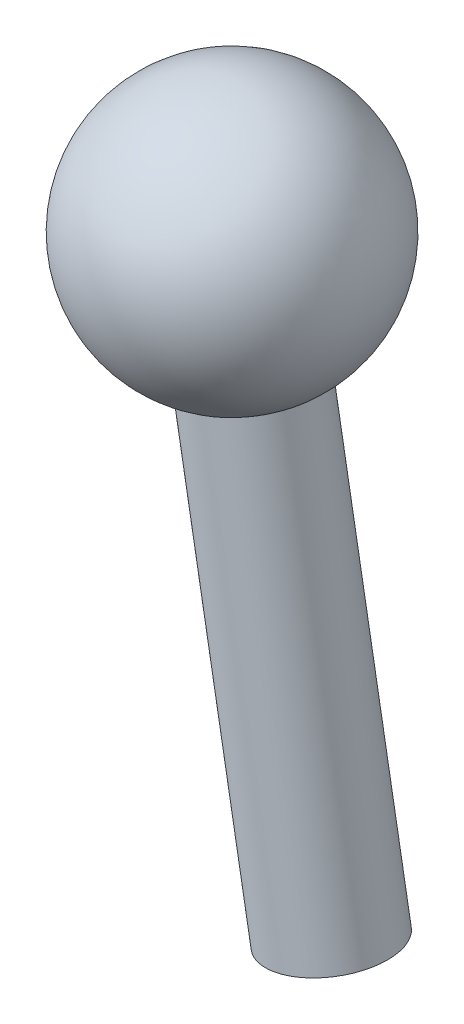
ISO-10303-21;
HEADER;
FILE_DESCRIPTION(('STEP AP214'),'2;1');
FILE_NAME('part.step','',(''),(''),'','','');
FILE_SCHEMA(('AUTOMOTIVE_DESIGN { 1 0 10303 214 1 1 1 1 }'));
ENDSEC;
DATA;
#1=APPLICATION_CONTEXT('core data for automotive mechanical design processes');
#2=APPLICATION_PROTOCOL_DEFINITION('international standard','automotive_design',2000,#1);
#3=PRODUCT_CONTEXT('',#1,'mechanical');
#4=PRODUCT('Part','Part','',(#3));
#5=PRODUCT_RELATED_PRODUCT_CATEGORY('part','',(#4));
#6=PRODUCT_DEFINITION_FORMATION('','',#4);
#7=PRODUCT_DEFINITION_CONTEXT('part definition',#1,'design');
#8=PRODUCT_DEFINITION('design','',#6,#7);
#9=PRODUCT_DEFINITION_SHAPE('','',#8);
#10=(LENGTH_UNIT() NAMED_UNIT(*) SI_UNIT(.MILLI.,.METRE.));
#11=(NAMED_UNIT(*) PLANE_ANGLE_UNIT() SI_UNIT($,.RADIAN.));
#12=(NAMED_UNIT(*) SI_UNIT($,.STERADIAN.) SOLID_ANGLE_UNIT());
#13=UNCERTAINTY_MEASURE_WITH_UNIT(LENGTH_MEASURE(1.E-05),#10,'distance_accuracy_value','');
#14=(GEOMETRIC_REPRESENTATION_CONTEXT(3) GLOBAL_UNCERTAINTY_ASSIGNED_CONTEXT((#13)) GLOBAL_UNIT_ASSIGNED_CONTEXT((#10,
#11,#12)) REPRESENTATION_CONTEXT('',''));
#15=CARTESIAN_POINT('',(0.,0.,0.));
#16=DIRECTION('',(0.,0.,1.));
#17=DIRECTION('',(1.,0.,0.));
#18=AXIS2_PLACEMENT_3D('',#15,#16,#17);
#19=CARTESIAN_POINT('',(580.571554721619,185.071629915476,1510.2586616298));
#20=DIRECTION('',(-0.173648177666917,0.98480775301221,0.));
#21=DIRECTION('',(0.984807753012211,0.173648177666917,0.));
#22=AXIS2_PLACEMENT_3D('',#19,#20,#21);
#23=CYLINDRICAL_SURFACE('',#22,5.00000000000005);
#24=CARTESIAN_POINT('',(573.68812936301,224.109475008454,1510.2586616298));
#25=DIRECTION('',(0.173648177666917,-0.98480775301221,0.));
#26=DIRECTION('',(0.98480775301221,0.173648177666917,0.));
#27=AXIS2_PLACEMENT_3D('',#24,#25,#26);
#28=CIRCLE('',#27,5.00000000000005);
#29=CARTESIAN_POINT('',(578.612168128071,224.977715896789,1510.2586616298));
#30=VERTEX_POINT('',#29);
#31=EDGE_CURVE('E10',#30,#30,#28,.T.);
#32=ORIENTED_EDGE('',*,*,#31,.T.);
#33=EDGE_LOOP('',(#32));
#34=FACE_BOUND('',#33,.T.);
#35=CARTESIAN_POINT('',(580.571554721619,185.071629915476,1510.2586616298));
#36=DIRECTION('',(-0.173648177666917,0.984807753012211,0.));
#37=DIRECTION('',(-0.98480775301221,-0.173648177666917,0.));
#38=AXIS2_PLACEMENT_3D('',#35,#36,#37);
#39=CIRCLE('',#38,5.00000000000005);
#40=CARTESIAN_POINT('',(575.647515956558,184.203389027141,1510.2586616298));
#41=VERTEX_POINT('',#40);
#42=EDGE_CURVE('E44',#41,#41,#39,.T.);
#43=ORIENTED_EDGE('',*,*,#42,.T.);
#44=EDGE_LOOP('',(#43));
#45=FACE_BOUND('',#44,.T.);
#46=ADVANCED_FACE('F37',(#34,#45),#23,.T.);
#47=CARTESIAN_POINT('',(580.571554721619,185.071629915476,1510.2586616298));
#48=DIRECTION('',(0.173648177666917,-0.984807753012211,0.));
#49=DIRECTION('',(-0.98480775301221,-0.173648177666917,0.));
#50=AXIS2_PLACEMENT_3D('',#47,#48,#49);
#51=PLANE('',#50);
#52=ORIENTED_EDGE('',*,*,#42,.F.);
#53=EDGE_LOOP('',(#52));
#54=FACE_BOUND('',#53,.T.);
#55=ADVANCED_FACE('F51',(#54),#51,.T.);
#56=CARTESIAN_POINT('',(571.889145838273,234.312017566086,1510.2586616298));
#57=DIRECTION('',(-0.98480775301221,-0.173648177666917,0.));
#58=DIRECTION('',(0.,0.,-1.));
#59=AXIS2_PLACEMENT_3D('',#56,#57,#58);
#60=SPHERICAL_SURFACE('',#59,11.5034002087455);
#61=CARTESIAN_POINT('',(571.889145838273,234.312017566086,1510.2586616298));
#62=DIRECTION('',(0.173648177666917,-0.98480775301221,0.));
#63=DIRECTION('',(0.98480775301221,0.173648177666917,0.));
#64=AXIS2_PLACEMENT_3D('',#61,#62,#63);
#65=SPHERICAL_SURFACE('',#64,11.5034002087455);
#66=ORIENTED_EDGE('',*,*,#31,.F.);
#67=EDGE_LOOP('',(#66));
#68=FACE_BOUND('',#67,.T.);
#69=ADVANCED_FACE('F39',(#68),#65,.T.);
#70=CLOSED_SHELL('',(#46,#55,#69));
#71=MANIFOLD_SOLID_BREP('B2',#70);
#72=ADVANCED_BREP_SHAPE_REPRESENTATION('',(#18,#71),#14);
#73=SHAPE_DEFINITION_REPRESENTATION(#9,#72);
ENDSEC;
END-ISO-10303-21;
